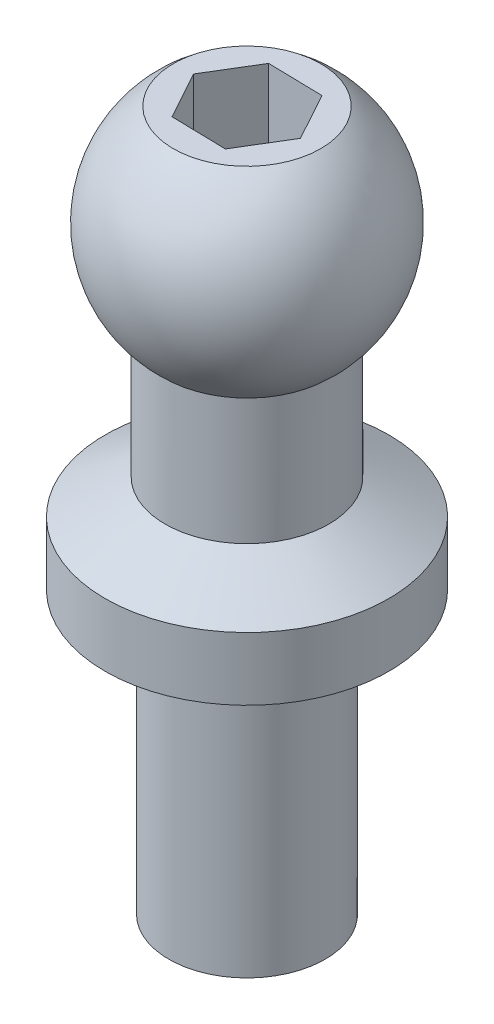
ISO-10303-21;
HEADER;
FILE_DESCRIPTION(('STEP AP214'),'2;1');
FILE_NAME('part.step','',(''),(''),'','','');
FILE_SCHEMA(('AUTOMOTIVE_DESIGN { 1 0 10303 214 1 1 1 1 }'));
ENDSEC;
DATA;
#1=APPLICATION_CONTEXT('core data for automotive mechanical design processes');
#2=APPLICATION_PROTOCOL_DEFINITION('international standard','automotive_design',2000,#1);
#3=PRODUCT_CONTEXT('',#1,'mechanical');
#4=PRODUCT('Part','Part','',(#3));
#5=PRODUCT_RELATED_PRODUCT_CATEGORY('part','',(#4));
#6=PRODUCT_DEFINITION_FORMATION('','',#4);
#7=PRODUCT_DEFINITION_CONTEXT('part definition',#1,'design');
#8=PRODUCT_DEFINITION('design','',#6,#7);
#9=PRODUCT_DEFINITION_SHAPE('','',#8);
#10=(LENGTH_UNIT() NAMED_UNIT(*) SI_UNIT(.MILLI.,.METRE.));
#11=(NAMED_UNIT(*) PLANE_ANGLE_UNIT() SI_UNIT($,.RADIAN.));
#12=(NAMED_UNIT(*) SI_UNIT($,.STERADIAN.) SOLID_ANGLE_UNIT());
#13=UNCERTAINTY_MEASURE_WITH_UNIT(LENGTH_MEASURE(1.E-05),#10,'distance_accuracy_value','');
#14=(GEOMETRIC_REPRESENTATION_CONTEXT(3) GLOBAL_UNCERTAINTY_ASSIGNED_CONTEXT((#13)) GLOBAL_UNIT_ASSIGNED_CONTEXT((#10,
#11,#12)) REPRESENTATION_CONTEXT('',''));
#15=CARTESIAN_POINT('',(0.,0.,0.));
#16=DIRECTION('',(0.,0.,1.));
#17=DIRECTION('',(1.,0.,0.));
#18=AXIS2_PLACEMENT_3D('',#15,#16,#17);
#19=CARTESIAN_POINT('',(0.,11.1,0.));
#20=DIRECTION('',(0.,-1.,0.));
#21=DIRECTION('',(0.,0.,-1.));
#22=AXIS2_PLACEMENT_3D('',#19,#20,#21);
#23=PLANE('',#22);
#24=CARTESIAN_POINT('',(0.,11.1,0.));
#25=DIRECTION('',(0.,-1.,0.));
#26=DIRECTION('',(0.,0.,-1.));
#27=AXIS2_PLACEMENT_3D('',#24,#25,#26);
#28=CIRCLE('',#27,1.16901183803458);
#29=CARTESIAN_POINT('',(1.16901183803458,11.1,0.));
#30=VERTEX_POINT('',#29);
#31=EDGE_CURVE('E12',#30,#30,#28,.F.);
#32=ORIENTED_EDGE('',*,*,#31,.T.);
#33=EDGE_LOOP('',(#32));
#34=FACE_BOUND('',#33,.T.);
#35=DIRECTION('',(-0.519014572754804,0.,0.854765390775825));
#36=VECTOR('',#35,1.);
#37=CARTESIAN_POINT('',(0.865813945551862,11.1,0.0191366582223046));
#38=LINE('',#37,#36);
#39=CARTESIAN_POINT('',(0.865813945551862,11.1,0.0191366582223046));
#40=VERTEX_POINT('',#39);
#41=CARTESIAN_POINT('',(0.416334140611875,11.1,0.759385200909902));
#42=VERTEX_POINT('',#41);
#43=EDGE_CURVE('E52',#40,#42,#38,.T.);
#44=ORIENTED_EDGE('',*,*,#43,.T.);
#45=DIRECTION('',(-0.999755829064999,0.,-0.0220971095520749));
#46=VECTOR('',#45,1.);
#47=CARTESIAN_POINT('',(0.416334140611875,11.1,0.759385200909902));
#48=LINE('',#47,#46);
#49=CARTESIAN_POINT('',(-0.449479804939987,11.1,0.740248542687597));
#50=VERTEX_POINT('',#49);
#51=EDGE_CURVE('E123',#42,#50,#48,.T.);
#52=ORIENTED_EDGE('',*,*,#51,.T.);
#53=DIRECTION('',(-0.480741256310195,0.,-0.876862500327899));
#54=VECTOR('',#53,1.);
#55=CARTESIAN_POINT('',(-0.449479804939987,11.1,0.740248542687597));
#56=LINE('',#55,#54);
#57=CARTESIAN_POINT('',(-0.865813945551862,11.1,-0.0191366582223043));
#58=VERTEX_POINT('',#57);
#59=EDGE_CURVE('E126',#50,#58,#56,.T.);
#60=ORIENTED_EDGE('',*,*,#59,.T.);
#61=DIRECTION('',(0.519014572754804,0.,-0.854765390775825));
#62=VECTOR('',#61,1.);
#63=CARTESIAN_POINT('',(-0.865813945551862,11.1,-0.0191366582223043));
#64=LINE('',#63,#62);
#65=CARTESIAN_POINT('',(-0.416334140611875,11.1,-0.759385200909901));
#66=VERTEX_POINT('',#65);
#67=EDGE_CURVE('E129',#58,#66,#64,.T.);
#68=ORIENTED_EDGE('',*,*,#67,.T.);
#69=DIRECTION('',(0.999755829064999,0.,0.0220971095520744));
#70=VECTOR('',#69,1.);
#71=CARTESIAN_POINT('',(-0.416334140611875,11.1,-0.759385200909901));
#72=LINE('',#71,#70);
#73=CARTESIAN_POINT('',(0.449479804939987,11.1,-0.740248542687597));
#74=VERTEX_POINT('',#73);
#75=EDGE_CURVE('E113',#66,#74,#72,.T.);
#76=ORIENTED_EDGE('',*,*,#75,.T.);
#77=DIRECTION('',(0.480741256310195,0.,0.876862500327899));
#78=VECTOR('',#77,1.);
#79=CARTESIAN_POINT('',(0.449479804939987,11.1,-0.740248542687597));
#80=LINE('',#79,#78);
#81=EDGE_CURVE('E132',#74,#40,#80,.T.);
#82=ORIENTED_EDGE('',*,*,#81,.T.);
#83=EDGE_LOOP('',(#44,#52,#60,#68,#76,#82));
#84=FACE_BOUND('',#83,.T.);
#85=ADVANCED_FACE('F37',(#34,#84),#23,.F.);
#86=CARTESIAN_POINT('',(0.,0.,0.));
#87=DIRECTION('',(0.,-1.,0.));
#88=DIRECTION('',(0.,0.,-1.));
#89=AXIS2_PLACEMENT_3D('',#86,#87,#88);
#90=PLANE('',#89);
#91=CARTESIAN_POINT('',(0.,0.,0.));
#92=DIRECTION('',(0.,-1.,0.));
#93=DIRECTION('',(0.,0.,-1.));
#94=AXIS2_PLACEMENT_3D('',#91,#92,#93);
#95=CIRCLE('',#94,1.24);
#96=CARTESIAN_POINT('',(0.,0.,-1.24));
#97=VERTEX_POINT('',#96);
#98=EDGE_CURVE('E45',#97,#97,#95,.T.);
#99=ORIENTED_EDGE('',*,*,#98,.T.);
#100=EDGE_LOOP('',(#99));
#101=FACE_BOUND('',#100,.T.);
#102=ADVANCED_FACE('F39',(#101),#90,.T.);
#103=CARTESIAN_POINT('',(0.,0.,0.));
#104=DIRECTION('',(0.,-1.,0.));
#105=DIRECTION('',(0.,0.,-1.));
#106=AXIS2_PLACEMENT_3D('',#103,#104,#105);
#107=CYLINDRICAL_SURFACE('',#106,1.24);
#108=CARTESIAN_POINT('',(0.,4.46,0.));
#109=DIRECTION('',(0.,-1.,0.));
#110=DIRECTION('',(0.,0.,-1.));
#111=AXIS2_PLACEMENT_3D('',#108,#109,#110);
#112=CIRCLE('',#111,1.24);
#113=CARTESIAN_POINT('',(0.,4.46,-1.24));
#114=VERTEX_POINT('',#113);
#115=EDGE_CURVE('E155',#114,#114,#112,.T.);
#116=ORIENTED_EDGE('',*,*,#115,.T.);
#117=EDGE_LOOP('',(#116));
#118=FACE_BOUND('',#117,.T.);
#119=ORIENTED_EDGE('',*,*,#98,.F.);
#120=EDGE_LOOP('',(#119));
#121=FACE_BOUND('',#120,.T.);
#122=ADVANCED_FACE('F161',(#118,#121),#107,.T.);
#123=CARTESIAN_POINT('',(1.24,4.46,0.));
#124=DIRECTION('',(0.,-1.,0.));
#125=DIRECTION('',(0.,0.,-1.));
#126=AXIS2_PLACEMENT_3D('',#123,#124,#125);
#127=PLANE('',#126);
#128=CARTESIAN_POINT('',(0.,4.46,0.));
#129=DIRECTION('',(0.,-1.,0.));
#130=DIRECTION('',(0.,0.,-1.));
#131=AXIS2_PLACEMENT_3D('',#128,#129,#130);
#132=CIRCLE('',#131,2.25);
#133=CARTESIAN_POINT('',(0.,4.46,-2.25));
#134=VERTEX_POINT('',#133);
#135=EDGE_CURVE('E152',#134,#134,#132,.T.);
#136=ORIENTED_EDGE('',*,*,#135,.T.);
#137=EDGE_LOOP('',(#136));
#138=FACE_BOUND('',#137,.T.);
#139=ORIENTED_EDGE('',*,*,#115,.F.);
#140=EDGE_LOOP('',(#139));
#141=FACE_BOUND('',#140,.T.);
#142=ADVANCED_FACE('F163',(#138,#141),#127,.T.);
#143=CARTESIAN_POINT('',(0.,0.,0.));
#144=DIRECTION('',(0.,-1.,0.));
#145=DIRECTION('',(0.,0.,-1.));
#146=AXIS2_PLACEMENT_3D('',#143,#144,#145);
#147=CYLINDRICAL_SURFACE('',#146,2.25);
#148=CARTESIAN_POINT('',(0.,5.46,0.));
#149=DIRECTION('',(0.,-1.,0.));
#150=DIRECTION('',(0.,0.,-1.));
#151=AXIS2_PLACEMENT_3D('',#148,#149,#150);
#152=CIRCLE('',#151,2.25);
#153=CARTESIAN_POINT('',(0.,5.46,-2.25));
#154=VERTEX_POINT('',#153);
#155=EDGE_CURVE('E149',#154,#154,#152,.T.);
#156=ORIENTED_EDGE('',*,*,#155,.T.);
#157=EDGE_LOOP('',(#156));
#158=FACE_BOUND('',#157,.T.);
#159=ORIENTED_EDGE('',*,*,#135,.F.);
#160=EDGE_LOOP('',(#159));
#161=FACE_BOUND('',#160,.T.);
#162=ADVANCED_FACE('F169',(#158,#161),#147,.T.);
#163=CARTESIAN_POINT('',(0.,5.46,0.));
#164=DIRECTION('',(0.,-1.,0.));
#165=DIRECTION('',(0.,0.,-1.));
#166=AXIS2_PLACEMENT_3D('',#163,#164,#165);
#167=CONICAL_SURFACE('',#166,2.25,1.0471975511966);
#168=CARTESIAN_POINT('',(0.,6.00848275573014,0.));
#169=DIRECTION('',(0.,-1.,0.));
#170=DIRECTION('',(0.,0.,-1.));
#171=AXIS2_PLACEMENT_3D('',#168,#169,#170);
#172=CIRCLE('',#171,1.3);
#173=CARTESIAN_POINT('',(0.,6.00848275573014,-1.3));
#174=VERTEX_POINT('',#173);
#175=EDGE_CURVE('E146',#174,#174,#172,.T.);
#176=ORIENTED_EDGE('',*,*,#175,.T.);
#177=EDGE_LOOP('',(#176));
#178=FACE_BOUND('',#177,.T.);
#179=ORIENTED_EDGE('',*,*,#155,.F.);
#180=EDGE_LOOP('',(#179));
#181=FACE_BOUND('',#180,.T.);
#182=ADVANCED_FACE('F189',(#178,#181),#167,.T.);
#183=CARTESIAN_POINT('',(0.,0.,0.));
#184=DIRECTION('',(0.,-1.,0.));
#185=DIRECTION('',(0.,0.,-1.));
#186=AXIS2_PLACEMENT_3D('',#183,#184,#185);
#187=CYLINDRICAL_SURFACE('',#186,1.3);
#188=CARTESIAN_POINT('',(0.,8.00848275573014,0.));
#189=DIRECTION('',(0.,-1.,0.));
#190=DIRECTION('',(0.,0.,-1.));
#191=AXIS2_PLACEMENT_3D('',#188,#189,#190);
#192=CIRCLE('',#191,1.3);
#193=CARTESIAN_POINT('',(1.3,8.00848275573014,0.));
#194=VERTEX_POINT('',#193);
#195=EDGE_CURVE('E143',#194,#194,#192,.T.);
#196=ORIENTED_EDGE('',*,*,#195,.T.);
#197=EDGE_LOOP('',(#196));
#198=FACE_BOUND('',#197,.T.);
#199=ORIENTED_EDGE('',*,*,#175,.F.);
#200=EDGE_LOOP('',(#199));
#201=FACE_BOUND('',#200,.T.);
#202=ADVANCED_FACE('F185',(#198,#201),#187,.T.);
#203=CARTESIAN_POINT('',(0.,9.50193513193769,0.));
#204=DIRECTION('',(0.,-1.,0.));
#205=DIRECTION('',(1.,0.,0.));
#206=AXIS2_PLACEMENT_3D('',#203,#204,#205);
#207=SPHERICAL_SURFACE('',#206,1.98);
#208=CARTESIAN_POINT('',(1.16901183803458,11.1,0.));
#209=CARTESIAN_POINT('',(1.19887257785999,11.0781578045277,0.));
#210=CARTESIAN_POINT('',(1.22811966032648,11.055476918277,0.));
#211=CARTESIAN_POINT('',(1.28529789478522,11.0085129827459,0.));
#212=CARTESIAN_POINT('',(1.31322904677746,10.9842299334655,0.));
#213=CARTESIAN_POINT('',(1.36768680453123,10.9341368904013,0.));
#214=CARTESIAN_POINT('',(1.39421341029276,10.9083268966177,0.));
#215=CARTESIAN_POINT('',(1.44577897968883,10.8552613283629,0.));
#216=CARTESIAN_POINT('',(1.47081794332336,10.8280057538917,0.));
#217=CARTESIAN_POINT('',(1.51932950901287,10.7721345678334,0.));
#218=CARTESIAN_POINT('',(1.54280211106784,10.7435189562463,0.));
#219=CARTESIAN_POINT('',(1.58810723419827,10.6850176087363,0.));
#220=CARTESIAN_POINT('',(1.60993975527373,10.6551318728134,0.));
#221=CARTESIAN_POINT('',(1.65189612784282,10.5941841534026,0.));
#222=CARTESIAN_POINT('',(1.67201997933647,10.5631221699146,0.));
#223=CARTESIAN_POINT('',(1.7104957974184,10.499919534129,0.));
#224=CARTESIAN_POINT('',(1.72884776400669,10.4677788818312,0.));
#225=CARTESIAN_POINT('',(1.76372216157643,10.4025198738199,0.));
#226=CARTESIAN_POINT('',(1.78024459255788,10.3694015181063,0.));
#227=CARTESIAN_POINT('',(1.81140801587673,10.3022911404877,0.));
#228=CARTESIAN_POINT('',(1.82604900821413,10.2682991185827,0.));
#229=CARTESIAN_POINT('',(1.85340356139899,10.1995481901836,0.));
#230=CARTESIAN_POINT('',(1.86611712224644,10.1647892836896,0.));
#231=CARTESIAN_POINT('',(1.8895768744168,10.0946137768215,0.));
#232=CARTESIAN_POINT('',(1.9003230657397,10.0591971764474,0.));
#233=CARTESIAN_POINT('',(1.91981432106058,9.98781753858069,0.));
#234=CARTESIAN_POINT('',(1.92855938505857,9.95185450108804,0.));
#235=CARTESIAN_POINT('',(1.94402091421936,9.87949496231109,0.));
#236=CARTESIAN_POINT('',(1.95073737938217,9.8430984610268,0.));
#237=CARTESIAN_POINT('',(1.96212061194802,9.76998632966446,0.));
#238=CARTESIAN_POINT('',(1.96678737935107,9.73327069958641,0.));
#239=CARTESIAN_POINT('',(1.97405655633884,9.65963564813728,0.));
#240=CARTESIAN_POINT('',(1.97665896592357,9.6227162267662,0.));
#241=CARTESIAN_POINT('',(1.97979125213464,9.54878957041623,0.));
#242=CARTESIAN_POINT('',(1.980321128761,9.51178233543734,0.));
#243=CARTESIAN_POINT('',(1.97930668451505,9.4377963054123,0.));
#244=CARTESIAN_POINT('',(1.97776236364275,9.40081751036614,0.));
#245=CARTESIAN_POINT('',(1.97260437568784,9.32700452440669,0.));
#246=CARTESIAN_POINT('',(1.96899070860523,9.2901703334934,0.));
#247=CARTESIAN_POINT('',(1.95970538010719,9.2167622657441,0.));
#248=CARTESIAN_POINT('',(1.95403371869176,9.18018838890809,0.));
#249=CARTESIAN_POINT('',(1.94065021833343,9.10741584151468,0.));
#250=CARTESIAN_POINT('',(1.93293837939053,9.07121717095728,0.));
#251=CARTESIAN_POINT('',(1.91549874974418,8.99930874965708,0.));
#252=CARTESIAN_POINT('',(1.90577095904074,8.96359899891428,0.));
#253=CARTESIAN_POINT('',(1.88432998448862,8.89278059490846,0.));
#254=CARTESIAN_POINT('',(1.87261680063995,8.85767194164545,0.));
#255=CARTESIAN_POINT('',(1.84724183530612,8.78816602195964,0.));
#256=CARTESIAN_POINT('',(1.83358005382096,8.75376875553683,0.));
#257=CARTESIAN_POINT('',(1.80435080987476,8.68579366428416,0.));
#258=CARTESIAN_POINT('',(1.78878334741371,8.6522158394543,0.));
#259=CARTESIAN_POINT('',(1.75579164508238,8.58598511150563,0.));
#260=CARTESIAN_POINT('',(1.7383674052121,8.55333220838684,0.));
#261=CARTESIAN_POINT('',(1.70171688277798,8.48905390018068,0.));
#262=CARTESIAN_POINT('',(1.68249060021413,8.45742849509331,0.));
#263=CARTESIAN_POINT('',(1.64229639427469,8.39530452507168,0.));
#264=CARTESIAN_POINT('',(1.62132847089909,8.36480596013742,0.));
#265=CARTESIAN_POINT('',(1.57771683293474,8.30503149676658,0.));
#266=CARTESIAN_POINT('',(1.555073118346,8.27575559833,0.));
#267=CARTESIAN_POINT('',(1.50818109927112,8.21851836369704,0.));
#268=CARTESIAN_POINT('',(1.48393279478498,8.19055702750067,0.));
#269=CARTESIAN_POINT('',(1.43390751154883,8.13603701851191,0.));
#270=CARTESIAN_POINT('',(1.40813053279881,8.10947834571952,0.));
#271=CARTESIAN_POINT('',(1.35512983656611,8.05784610835528,0.));
#272=CARTESIAN_POINT('',(1.32790611908342,8.03277254378344,0.));
#273=CARTESIAN_POINT('',(1.3,8.00848275573014,0.));
#274=B_SPLINE_CURVE_WITH_KNOTS('',3,(#208,#209,#210,#211,#212,#213,#214,#215,#216,#217,#218,
#219,#220,#221,#222,#223,#224,#225,#226,#227,#228,#229,#230,#231,#232,#233,#234,#235,#236,#237,
#238,#239,#240,#241,#242,#243,#244,#245,#246,#247,#248,#249,#250,#251,#252,#253,#254,#255,#256,
#257,#258,#259,#260,#261,#262,#263,#264,#265,#266,#267,#268,#269,#270,#271,#272,#273),
.UNSPECIFIED.,.F.,.F.,(4,2,2,2,2,2,2,2,2,2,2,2,2,2,2,2,2,2,2,2,2,2,2,2,2,2,2,2,2,2,2,2,4),(0.,
0.110974951936607,0.221949903873214,0.332924855809822,0.443899807746428,0.554874759683036,
0.665849711619644,0.776824663556251,0.887799615492858,0.998774567429466,1.10974951936607,
1.22072447130268,1.33169942323929,1.4426743751759,1.5536493271125,1.66462427904911,
1.77559923098572,1.88657418292232,1.99754913485893,2.10852408679554,2.21949903873214,
2.33047399066875,2.44144894260536,2.55242389454197,2.66339884647858,2.77437379841518,
2.88534875035179,2.9963237022884,3.107298654225,3.21827360616161,3.32924855809822,
3.44022351003483,3.55119846197143),.UNSPECIFIED.);
#275=EDGE_CURVE('BSEAM182',#30,#194,#274,.T.);
#276=ORIENTED_EDGE('',*,*,#31,.F.);
#277=ORIENTED_EDGE('',*,*,#195,.F.);
#278=ORIENTED_EDGE('',*,*,#275,.T.);
#279=ORIENTED_EDGE('',*,*,#275,.F.);
#280=EDGE_LOOP('',(#276,#278,#277,#279));
#281=FACE_BOUND('',#280,.T.);
#282=ADVANCED_FACE('F182',(#281),#207,.T.);
#283=CARTESIAN_POINT('',(0.865813945551862,9.6,0.0191366582223046));
#284=DIRECTION('',(-0.854765390775825,0.,-0.519014572754804));
#285=DIRECTION('',(-0.519014572754804,0.,0.854765390775825));
#286=AXIS2_PLACEMENT_3D('',#283,#284,#285);
#287=PLANE('',#286);
#288=ORIENTED_EDGE('',*,*,#43,.F.);
#289=DIRECTION('',(0.,1.,0.));
#290=VECTOR('',#289,1.);
#291=CARTESIAN_POINT('',(0.865813945551862,9.6,0.0191366582223046));
#292=LINE('',#291,#290);
#293=CARTESIAN_POINT('',(0.865813945551862,9.6,0.0191366582223046));
#294=VERTEX_POINT('',#293);
#295=EDGE_CURVE('E118',#294,#40,#292,.T.);
#296=ORIENTED_EDGE('',*,*,#295,.F.);
#297=DIRECTION('',(-0.519014572754804,0.,0.854765390775825));
#298=VECTOR('',#297,1.);
#299=CARTESIAN_POINT('',(0.865813945551862,9.6,0.0191366582223046));
#300=LINE('',#299,#298);
#301=CARTESIAN_POINT('',(0.416334140611875,9.6,0.759385200909902));
#302=VERTEX_POINT('',#301);
#303=EDGE_CURVE('E135',#294,#302,#300,.T.);
#304=ORIENTED_EDGE('',*,*,#303,.T.);
#305=DIRECTION('',(0.,1.,0.));
#306=VECTOR('',#305,1.);
#307=CARTESIAN_POINT('',(0.416334140611875,9.6,0.759385200909902));
#308=LINE('',#307,#306);
#309=EDGE_CURVE('E141',#302,#42,#308,.T.);
#310=ORIENTED_EDGE('',*,*,#309,.T.);
#311=EDGE_LOOP('',(#288,#296,#304,#310));
#312=FACE_BOUND('',#311,.T.);
#313=ADVANCED_FACE('F180',(#312),#287,.T.);
#314=CARTESIAN_POINT('',(0.416334140611875,9.6,0.759385200909902));
#315=DIRECTION('',(0.0220971095520749,0.,-0.999755829064999));
#316=DIRECTION('',(-0.999755829064999,0.,-0.0220971095520749));
#317=AXIS2_PLACEMENT_3D('',#314,#315,#316);
#318=PLANE('',#317);
#319=ORIENTED_EDGE('',*,*,#51,.F.);
#320=ORIENTED_EDGE('',*,*,#309,.F.);
#321=DIRECTION('',(-0.999755829064999,0.,-0.0220971095520749));
#322=VECTOR('',#321,1.);
#323=CARTESIAN_POINT('',(0.416334140611875,9.6,0.759385200909902));
#324=LINE('',#323,#322);
#325=CARTESIAN_POINT('',(-0.449479804939987,9.6,0.740248542687597));
#326=VERTEX_POINT('',#325);
#327=EDGE_CURVE('E91',#302,#326,#324,.T.);
#328=ORIENTED_EDGE('',*,*,#327,.T.);
#329=DIRECTION('',(0.,1.,0.));
#330=VECTOR('',#329,1.);
#331=CARTESIAN_POINT('',(-0.449479804939987,9.6,0.740248542687597));
#332=LINE('',#331,#330);
#333=EDGE_CURVE('E139',#326,#50,#332,.T.);
#334=ORIENTED_EDGE('',*,*,#333,.T.);
#335=EDGE_LOOP('',(#319,#320,#328,#334));
#336=FACE_BOUND('',#335,.T.);
#337=ADVANCED_FACE('F224',(#336),#318,.T.);
#338=CARTESIAN_POINT('',(-0.449479804939987,9.6,0.740248542687597));
#339=DIRECTION('',(0.876862500327899,0.,-0.480741256310195));
#340=DIRECTION('',(-0.480741256310195,0.,-0.876862500327899));
#341=AXIS2_PLACEMENT_3D('',#338,#339,#340);
#342=PLANE('',#341);
#343=ORIENTED_EDGE('',*,*,#59,.F.);
#344=ORIENTED_EDGE('',*,*,#333,.F.);
#345=DIRECTION('',(-0.480741256310195,0.,-0.876862500327899));
#346=VECTOR('',#345,1.);
#347=CARTESIAN_POINT('',(-0.449479804939987,9.6,0.740248542687597));
#348=LINE('',#347,#346);
#349=CARTESIAN_POINT('',(-0.865813945551862,9.6,-0.0191366582223043));
#350=VERTEX_POINT('',#349);
#351=EDGE_CURVE('E109',#326,#350,#348,.T.);
#352=ORIENTED_EDGE('',*,*,#351,.T.);
#353=DIRECTION('',(0.,1.,0.));
#354=VECTOR('',#353,1.);
#355=CARTESIAN_POINT('',(-0.865813945551862,9.6,-0.0191366582223043));
#356=LINE('',#355,#354);
#357=EDGE_CURVE('E106',#350,#58,#356,.T.);
#358=ORIENTED_EDGE('',*,*,#357,.T.);
#359=EDGE_LOOP('',(#343,#344,#352,#358));
#360=FACE_BOUND('',#359,.T.);
#361=ADVANCED_FACE('F230',(#360),#342,.T.);
#362=CARTESIAN_POINT('',(-0.865813945551862,9.6,-0.0191366582223043));
#363=DIRECTION('',(0.854765390775825,0.,0.519014572754804));
#364=DIRECTION('',(0.519014572754804,0.,-0.854765390775825));
#365=AXIS2_PLACEMENT_3D('',#362,#363,#364);
#366=PLANE('',#365);
#367=ORIENTED_EDGE('',*,*,#67,.F.);
#368=ORIENTED_EDGE('',*,*,#357,.F.);
#369=DIRECTION('',(0.519014572754804,0.,-0.854765390775825));
#370=VECTOR('',#369,1.);
#371=CARTESIAN_POINT('',(-0.865813945551862,9.6,-0.0191366582223043));
#372=LINE('',#371,#370);
#373=CARTESIAN_POINT('',(-0.416334140611875,9.6,-0.759385200909901));
#374=VERTEX_POINT('',#373);
#375=EDGE_CURVE('E101',#350,#374,#372,.T.);
#376=ORIENTED_EDGE('',*,*,#375,.T.);
#377=DIRECTION('',(0.,1.,0.));
#378=VECTOR('',#377,1.);
#379=CARTESIAN_POINT('',(-0.416334140611875,9.6,-0.759385200909901));
#380=LINE('',#379,#378);
#381=EDGE_CURVE('E105',#374,#66,#380,.T.);
#382=ORIENTED_EDGE('',*,*,#381,.T.);
#383=EDGE_LOOP('',(#367,#368,#376,#382));
#384=FACE_BOUND('',#383,.T.);
#385=ADVANCED_FACE('F104',(#384),#366,.T.);
#386=CARTESIAN_POINT('',(-0.416334140611875,9.6,-0.759385200909901));
#387=DIRECTION('',(-0.0220971095520744,0.,0.999755829064999));
#388=DIRECTION('',(0.999755829064999,0.,0.0220971095520744));
#389=AXIS2_PLACEMENT_3D('',#386,#387,#388);
#390=PLANE('',#389);
#391=ORIENTED_EDGE('',*,*,#75,.F.);
#392=ORIENTED_EDGE('',*,*,#381,.F.);
#393=DIRECTION('',(0.999755829064999,0.,0.0220971095520744));
#394=VECTOR('',#393,1.);
#395=CARTESIAN_POINT('',(-0.416334140611875,9.6,-0.759385200909901));
#396=LINE('',#395,#394);
#397=CARTESIAN_POINT('',(0.449479804939987,9.6,-0.740248542687597));
#398=VERTEX_POINT('',#397);
#399=EDGE_CURVE('E108',#374,#398,#396,.T.);
#400=ORIENTED_EDGE('',*,*,#399,.T.);
#401=DIRECTION('',(0.,1.,0.));
#402=VECTOR('',#401,1.);
#403=CARTESIAN_POINT('',(0.449479804939987,9.6,-0.740248542687597));
#404=LINE('',#403,#402);
#405=EDGE_CURVE('E82',#398,#74,#404,.T.);
#406=ORIENTED_EDGE('',*,*,#405,.T.);
#407=EDGE_LOOP('',(#391,#392,#400,#406));
#408=FACE_BOUND('',#407,.T.);
#409=ADVANCED_FACE('F111',(#408),#390,.T.);
#410=CARTESIAN_POINT('',(0.449479804939987,9.6,-0.740248542687597));
#411=DIRECTION('',(-0.876862500327899,0.,0.480741256310195));
#412=DIRECTION('',(0.480741256310195,0.,0.8768625003279));
#413=AXIS2_PLACEMENT_3D('',#410,#411,#412);
#414=PLANE('',#413);
#415=ORIENTED_EDGE('',*,*,#81,.F.);
#416=ORIENTED_EDGE('',*,*,#405,.F.);
#417=DIRECTION('',(0.480741256310195,0.,0.876862500327899));
#418=VECTOR('',#417,1.);
#419=CARTESIAN_POINT('',(0.449479804939987,9.6,-0.740248542687597));
#420=LINE('',#419,#418);
#421=EDGE_CURVE('E60',#398,#294,#420,.T.);
#422=ORIENTED_EDGE('',*,*,#421,.T.);
#423=ORIENTED_EDGE('',*,*,#295,.T.);
#424=EDGE_LOOP('',(#415,#416,#422,#423));
#425=FACE_BOUND('',#424,.T.);
#426=ADVANCED_FACE('F250',(#425),#414,.T.);
#427=CARTESIAN_POINT('',(0.,9.6,0.));
#428=DIRECTION('',(0.,-1.,0.));
#429=DIRECTION('',(0.,0.,-1.));
#430=AXIS2_PLACEMENT_3D('',#427,#428,#429);
#431=PLANE('',#430);
#432=ORIENTED_EDGE('',*,*,#303,.F.);
#433=ORIENTED_EDGE('',*,*,#421,.F.);
#434=ORIENTED_EDGE('',*,*,#399,.F.);
#435=ORIENTED_EDGE('',*,*,#375,.F.);
#436=ORIENTED_EDGE('',*,*,#351,.F.);
#437=ORIENTED_EDGE('',*,*,#327,.F.);
#438=EDGE_LOOP('',(#432,#433,#434,#435,#436,#437));
#439=FACE_BOUND('',#438,.T.);
#440=ADVANCED_FACE('F116',(#439),#431,.F.);
#441=CLOSED_SHELL('',(#85,#102,#122,#142,#162,#182,#202,#282,#313,#337,#361,#385,#409,#426,#440));
#442=MANIFOLD_SOLID_BREP('B2',#441);
#443=ADVANCED_BREP_SHAPE_REPRESENTATION('',(#18,#442),#14);
#444=SHAPE_DEFINITION_REPRESENTATION(#9,#443);
ENDSEC;
END-ISO-10303-21;
